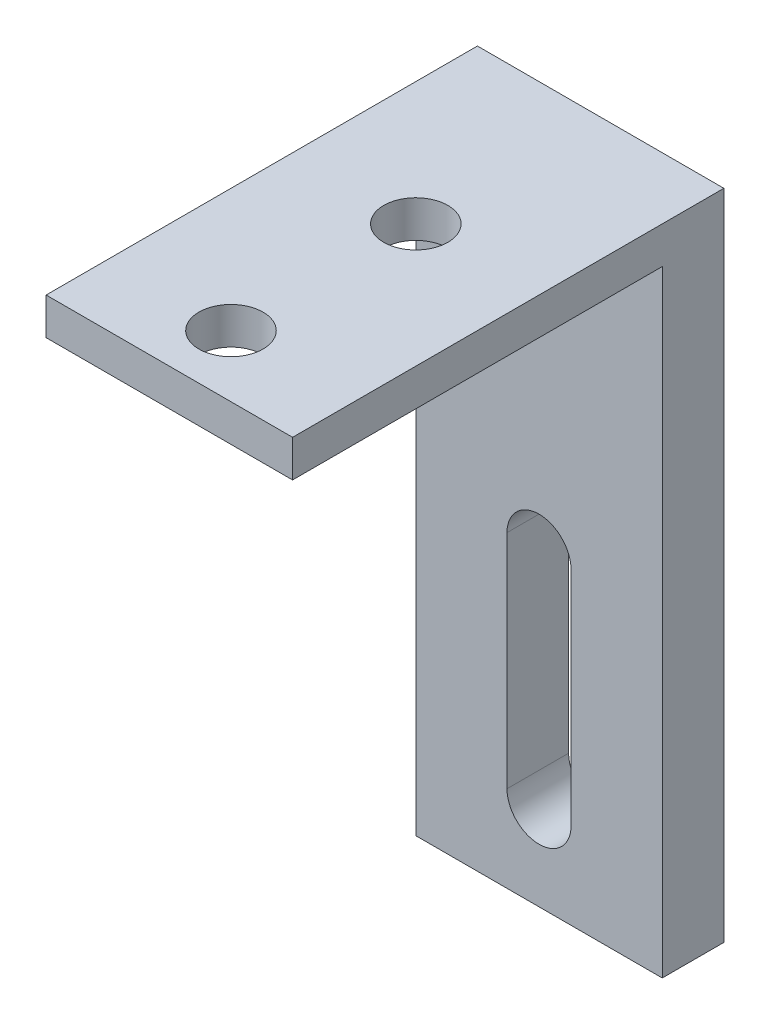
ISO-10303-21;
HEADER;
FILE_DESCRIPTION(('STEP AP214'),'2;1');
FILE_NAME('part.step','',(''),(''),'','','');
FILE_SCHEMA(('AUTOMOTIVE_DESIGN { 1 0 10303 214 1 1 1 1 }'));
ENDSEC;
DATA;
#1=APPLICATION_CONTEXT('core data for automotive mechanical design processes');
#2=APPLICATION_PROTOCOL_DEFINITION('international standard','automotive_design',2000,#1);
#3=PRODUCT_CONTEXT('',#1,'mechanical');
#4=PRODUCT('Part','Part','',(#3));
#5=PRODUCT_RELATED_PRODUCT_CATEGORY('part','',(#4));
#6=PRODUCT_DEFINITION_FORMATION('','',#4);
#7=PRODUCT_DEFINITION_CONTEXT('part definition',#1,'design');
#8=PRODUCT_DEFINITION('design','',#6,#7);
#9=PRODUCT_DEFINITION_SHAPE('','',#8);
#10=(LENGTH_UNIT() NAMED_UNIT(*) SI_UNIT(.MILLI.,.METRE.));
#11=(NAMED_UNIT(*) PLANE_ANGLE_UNIT() SI_UNIT($,.RADIAN.));
#12=(NAMED_UNIT(*) SI_UNIT($,.STERADIAN.) SOLID_ANGLE_UNIT());
#13=UNCERTAINTY_MEASURE_WITH_UNIT(LENGTH_MEASURE(1.E-05),#10,'distance_accuracy_value','');
#14=(GEOMETRIC_REPRESENTATION_CONTEXT(3) GLOBAL_UNCERTAINTY_ASSIGNED_CONTEXT((#13)) GLOBAL_UNIT_ASSIGNED_CONTEXT((#10,
#11,#12)) REPRESENTATION_CONTEXT('',''));
#15=CARTESIAN_POINT('',(0.,0.,0.));
#16=DIRECTION('',(0.,0.,1.));
#17=DIRECTION('',(1.,0.,0.));
#18=AXIS2_PLACEMENT_3D('',#15,#16,#17);
#19=CARTESIAN_POINT('',(0.,0.,0.));
#20=DIRECTION('',(0.,1.,0.));
#21=DIRECTION('',(0.,0.,1.));
#22=AXIS2_PLACEMENT_3D('',#19,#20,#21);
#23=PLANE('',#22);
#24=CARTESIAN_POINT('',(0.,0.,0.));
#25=DIRECTION('',(0.,1.,0.));
#26=DIRECTION('',(0.,0.,1.));
#27=AXIS2_PLACEMENT_3D('',#24,#25,#26);
#28=CIRCLE('',#27,2.6);
#29=CARTESIAN_POINT('',(0.,0.,2.6));
#30=VERTEX_POINT('',#29);
#31=EDGE_CURVE('E200',#30,#30,#28,.T.);
#32=ORIENTED_EDGE('',*,*,#31,.T.);
#33=EDGE_LOOP('',(#32));
#34=FACE_BOUND('',#33,.T.);
#35=CARTESIAN_POINT('',(0.,0.,15.));
#36=DIRECTION('',(0.,1.,0.));
#37=DIRECTION('',(0.,0.,1.));
#38=AXIS2_PLACEMENT_3D('',#35,#36,#37);
#39=CIRCLE('',#38,2.6);
#40=CARTESIAN_POINT('',(0.,0.,17.6));
#41=VERTEX_POINT('',#40);
#42=EDGE_CURVE('E47',#41,#41,#39,.T.);
#43=ORIENTED_EDGE('',*,*,#42,.T.);
#44=EDGE_LOOP('',(#43));
#45=FACE_BOUND('',#44,.T.);
#46=DIRECTION('',(-1.,0.,0.));
#47=VECTOR('',#46,1.);
#48=CARTESIAN_POINT('',(10.,0.,-10.));
#49=LINE('',#48,#47);
#50=CARTESIAN_POINT('',(10.,0.,-10.));
#51=VERTEX_POINT('',#50);
#52=CARTESIAN_POINT('',(-10.,0.,-10.));
#53=VERTEX_POINT('',#52);
#54=EDGE_CURVE('E154',#51,#53,#49,.T.);
#55=ORIENTED_EDGE('',*,*,#54,.F.);
#56=DIRECTION('',(0.,0.,-1.));
#57=VECTOR('',#56,1.);
#58=CARTESIAN_POINT('',(10.,0.,-10.));
#59=LINE('',#58,#57);
#60=CARTESIAN_POINT('',(10.,0.,20.));
#61=VERTEX_POINT('',#60);
#62=EDGE_CURVE('E204',#61,#51,#59,.T.);
#63=ORIENTED_EDGE('',*,*,#62,.F.);
#64=DIRECTION('',(1.,0.,0.));
#65=VECTOR('',#64,1.);
#66=CARTESIAN_POINT('',(-10.,0.,20.));
#67=LINE('',#66,#65);
#68=CARTESIAN_POINT('',(-10.,0.,20.));
#69=VERTEX_POINT('',#68);
#70=EDGE_CURVE('E191',#69,#61,#67,.T.);
#71=ORIENTED_EDGE('',*,*,#70,.F.);
#72=DIRECTION('',(0.,0.,1.));
#73=VECTOR('',#72,1.);
#74=CARTESIAN_POINT('',(-10.,0.,-10.));
#75=LINE('',#74,#73);
#76=EDGE_CURVE('E207',#53,#69,#75,.T.);
#77=ORIENTED_EDGE('',*,*,#76,.F.);
#78=EDGE_LOOP('',(#55,#63,#71,#77));
#79=FACE_BOUND('',#78,.T.);
#80=ADVANCED_FACE('F43',(#34,#45,#79),#23,.F.);
#81=CARTESIAN_POINT('',(0.,3.,0.));
#82=DIRECTION('',(0.,1.,0.));
#83=DIRECTION('',(0.,0.,1.));
#84=AXIS2_PLACEMENT_3D('',#81,#82,#83);
#85=PLANE('',#84);
#86=CARTESIAN_POINT('',(0.,3.,15.));
#87=DIRECTION('',(0.,1.,0.));
#88=DIRECTION('',(0.,0.,1.));
#89=AXIS2_PLACEMENT_3D('',#86,#87,#88);
#90=CIRCLE('',#89,2.6);
#91=CARTESIAN_POINT('',(0.,3.,17.6));
#92=VERTEX_POINT('',#91);
#93=EDGE_CURVE('E185',#92,#92,#90,.T.);
#94=ORIENTED_EDGE('',*,*,#93,.F.);
#95=EDGE_LOOP('',(#94));
#96=FACE_BOUND('',#95,.T.);
#97=DIRECTION('',(0.,0.,-1.));
#98=VECTOR('',#97,1.);
#99=CARTESIAN_POINT('',(10.,3.,-10.));
#100=LINE('',#99,#98);
#101=CARTESIAN_POINT('',(10.,3.,20.));
#102=VERTEX_POINT('',#101);
#103=CARTESIAN_POINT('',(10.,3.,-15.));
#104=VERTEX_POINT('',#103);
#105=EDGE_CURVE('E52',#102,#104,#100,.T.);
#106=ORIENTED_EDGE('',*,*,#105,.T.);
#107=DIRECTION('',(1.,0.,0.));
#108=VECTOR('',#107,1.);
#109=CARTESIAN_POINT('',(-10.,3.,-15.));
#110=LINE('',#109,#108);
#111=CARTESIAN_POINT('',(-10.,3.,-15.));
#112=VERTEX_POINT('',#111);
#113=EDGE_CURVE('E182',#112,#104,#110,.T.);
#114=ORIENTED_EDGE('',*,*,#113,.F.);
#115=DIRECTION('',(0.,0.,1.));
#116=VECTOR('',#115,1.);
#117=CARTESIAN_POINT('',(-10.,3.,-10.));
#118=LINE('',#117,#116);
#119=CARTESIAN_POINT('',(-10.,3.,20.));
#120=VERTEX_POINT('',#119);
#121=EDGE_CURVE('E11',#112,#120,#118,.T.);
#122=ORIENTED_EDGE('',*,*,#121,.T.);
#123=DIRECTION('',(-1.,0.,0.));
#124=VECTOR('',#123,1.);
#125=CARTESIAN_POINT('',(10.,3.,20.));
#126=LINE('',#125,#124);
#127=EDGE_CURVE('E197',#102,#120,#126,.T.);
#128=ORIENTED_EDGE('',*,*,#127,.F.);
#129=EDGE_LOOP('',(#106,#114,#122,#128));
#130=FACE_BOUND('',#129,.T.);
#131=CARTESIAN_POINT('',(0.,3.,0.));
#132=DIRECTION('',(0.,1.,0.));
#133=DIRECTION('',(0.,0.,1.));
#134=AXIS2_PLACEMENT_3D('',#131,#132,#133);
#135=CIRCLE('',#134,2.6);
#136=CARTESIAN_POINT('',(0.,3.,2.6));
#137=VERTEX_POINT('',#136);
#138=EDGE_CURVE('E201',#137,#137,#135,.T.);
#139=ORIENTED_EDGE('',*,*,#138,.F.);
#140=EDGE_LOOP('',(#139));
#141=FACE_BOUND('',#140,.T.);
#142=ADVANCED_FACE('F222',(#96,#130,#141),#85,.T.);
#143=CARTESIAN_POINT('',(10.,3.,-10.));
#144=DIRECTION('',(-1.,0.,0.));
#145=DIRECTION('',(0.,0.,1.));
#146=AXIS2_PLACEMENT_3D('',#143,#144,#145);
#147=PLANE('',#146);
#148=ORIENTED_EDGE('',*,*,#62,.T.);
#149=DIRECTION('',(0.,1.,0.));
#150=VECTOR('',#149,1.);
#151=CARTESIAN_POINT('',(10.,-50.,-10.));
#152=LINE('',#151,#150);
#153=CARTESIAN_POINT('',(10.,-50.,-10.));
#154=VERTEX_POINT('',#153);
#155=EDGE_CURVE('E174',#154,#51,#152,.T.);
#156=ORIENTED_EDGE('',*,*,#155,.F.);
#157=DIRECTION('',(0.,0.,1.));
#158=VECTOR('',#157,1.);
#159=CARTESIAN_POINT('',(10.,-50.,-15.));
#160=LINE('',#159,#158);
#161=CARTESIAN_POINT('',(10.,-50.,-15.));
#162=VERTEX_POINT('',#161);
#163=EDGE_CURVE('E158',#162,#154,#160,.T.);
#164=ORIENTED_EDGE('',*,*,#163,.F.);
#165=DIRECTION('',(0.,-1.,0.));
#166=VECTOR('',#165,1.);
#167=CARTESIAN_POINT('',(10.,3.,-15.));
#168=LINE('',#167,#166);
#169=EDGE_CURVE('E177',#104,#162,#168,.T.);
#170=ORIENTED_EDGE('',*,*,#169,.F.);
#171=ORIENTED_EDGE('',*,*,#105,.F.);
#172=DIRECTION('',(0.,1.,0.));
#173=VECTOR('',#172,1.);
#174=CARTESIAN_POINT('',(10.,0.,20.));
#175=LINE('',#174,#173);
#176=EDGE_CURVE('E194',#61,#102,#175,.T.);
#177=ORIENTED_EDGE('',*,*,#176,.F.);
#178=EDGE_LOOP('',(#148,#156,#164,#170,#171,#177));
#179=FACE_BOUND('',#178,.T.);
#180=ADVANCED_FACE('F45',(#179),#147,.F.);
#181=CARTESIAN_POINT('',(-10.,3.,-10.));
#182=DIRECTION('',(1.,0.,0.));
#183=DIRECTION('',(0.,0.,-1.));
#184=AXIS2_PLACEMENT_3D('',#181,#182,#183);
#185=PLANE('',#184);
#186=DIRECTION('',(0.,1.,0.));
#187=VECTOR('',#186,1.);
#188=CARTESIAN_POINT('',(-10.,0.,-15.));
#189=LINE('',#188,#187);
#190=CARTESIAN_POINT('',(-10.,-50.,-15.));
#191=VERTEX_POINT('',#190);
#192=EDGE_CURVE('E179',#191,#112,#189,.T.);
#193=ORIENTED_EDGE('',*,*,#192,.F.);
#194=DIRECTION('',(0.,0.,-1.));
#195=VECTOR('',#194,1.);
#196=CARTESIAN_POINT('',(-10.,-50.,-15.));
#197=LINE('',#196,#195);
#198=CARTESIAN_POINT('',(-10.,-50.,-10.));
#199=VERTEX_POINT('',#198);
#200=EDGE_CURVE('E163',#199,#191,#197,.T.);
#201=ORIENTED_EDGE('',*,*,#200,.F.);
#202=DIRECTION('',(0.,1.,0.));
#203=VECTOR('',#202,1.);
#204=CARTESIAN_POINT('',(-10.,-50.,-10.));
#205=LINE('',#204,#203);
#206=EDGE_CURVE('E169',#199,#53,#205,.T.);
#207=ORIENTED_EDGE('',*,*,#206,.T.);
#208=ORIENTED_EDGE('',*,*,#76,.T.);
#209=DIRECTION('',(0.,-1.,0.));
#210=VECTOR('',#209,1.);
#211=CARTESIAN_POINT('',(-10.,3.,20.));
#212=LINE('',#211,#210);
#213=EDGE_CURVE('E188',#120,#69,#212,.T.);
#214=ORIENTED_EDGE('',*,*,#213,.F.);
#215=ORIENTED_EDGE('',*,*,#121,.F.);
#216=EDGE_LOOP('',(#193,#201,#207,#208,#214,#215));
#217=FACE_BOUND('',#216,.T.);
#218=ADVANCED_FACE('F213',(#217),#185,.F.);
#219=CARTESIAN_POINT('',(0.,3.,0.));
#220=DIRECTION('',(0.,-1.,0.));
#221=DIRECTION('',(0.,0.,-1.));
#222=AXIS2_PLACEMENT_3D('',#219,#220,#221);
#223=CYLINDRICAL_SURFACE('',#222,2.6);
#224=ORIENTED_EDGE('',*,*,#138,.T.);
#225=EDGE_LOOP('',(#224));
#226=FACE_BOUND('',#225,.T.);
#227=ORIENTED_EDGE('',*,*,#31,.F.);
#228=EDGE_LOOP('',(#227));
#229=FACE_BOUND('',#228,.T.);
#230=ADVANCED_FACE('F256',(#226,#229),#223,.F.);
#231=CARTESIAN_POINT('',(0.,0.,20.));
#232=DIRECTION('',(0.,0.,1.));
#233=DIRECTION('',(1.,0.,0.));
#234=AXIS2_PLACEMENT_3D('',#231,#232,#233);
#235=PLANE('',#234);
#236=ORIENTED_EDGE('',*,*,#213,.T.);
#237=ORIENTED_EDGE('',*,*,#70,.T.);
#238=ORIENTED_EDGE('',*,*,#176,.T.);
#239=ORIENTED_EDGE('',*,*,#127,.T.);
#240=EDGE_LOOP('',(#236,#237,#238,#239));
#241=FACE_BOUND('',#240,.T.);
#242=ADVANCED_FACE('F219',(#241),#235,.T.);
#243=CARTESIAN_POINT('',(0.,-7.,15.));
#244=DIRECTION('',(0.,1.,0.));
#245=DIRECTION('',(0.,0.,1.));
#246=AXIS2_PLACEMENT_3D('',#243,#244,#245);
#247=CYLINDRICAL_SURFACE('',#246,2.6);
#248=ORIENTED_EDGE('',*,*,#93,.T.);
#249=EDGE_LOOP('',(#248));
#250=FACE_BOUND('',#249,.T.);
#251=ORIENTED_EDGE('',*,*,#42,.F.);
#252=EDGE_LOOP('',(#251));
#253=FACE_BOUND('',#252,.T.);
#254=ADVANCED_FACE('F241',(#250,#253),#247,.F.);
#255=CARTESIAN_POINT('',(0.,0.,-15.));
#256=DIRECTION('',(0.,0.,-1.));
#257=DIRECTION('',(-1.,0.,0.));
#258=AXIS2_PLACEMENT_3D('',#255,#256,#257);
#259=PLANE('',#258);
#260=CARTESIAN_POINT('',(0.,-25.,-15.));
#261=DIRECTION('',(0.,0.,-1.));
#262=DIRECTION('',(-1.,0.,0.));
#263=AXIS2_PLACEMENT_3D('',#260,#261,#262);
#264=CIRCLE('',#263,2.6);
#265=CARTESIAN_POINT('',(-2.6,-25.,-15.));
#266=VERTEX_POINT('',#265);
#267=CARTESIAN_POINT('',(2.6,-25.,-15.));
#268=VERTEX_POINT('',#267);
#269=EDGE_CURVE('E60',#266,#268,#264,.T.);
#270=ORIENTED_EDGE('',*,*,#269,.F.);
#271=DIRECTION('',(0.,-1.,0.));
#272=VECTOR('',#271,1.);
#273=CARTESIAN_POINT('',(-2.6,-25.,-15.));
#274=LINE('',#273,#272);
#275=CARTESIAN_POINT('',(-2.60000000000001,-43.,-15.));
#276=VERTEX_POINT('',#275);
#277=EDGE_CURVE('E139',#266,#276,#274,.T.);
#278=ORIENTED_EDGE('',*,*,#277,.T.);
#279=CARTESIAN_POINT('',(0.,-43.,-15.));
#280=DIRECTION('',(0.,0.,-1.));
#281=DIRECTION('',(-1.,0.,0.));
#282=AXIS2_PLACEMENT_3D('',#279,#280,#281);
#283=CIRCLE('',#282,2.6);
#284=CARTESIAN_POINT('',(2.59999999999999,-43.,-15.));
#285=VERTEX_POINT('',#284);
#286=EDGE_CURVE('E142',#285,#276,#283,.T.);
#287=ORIENTED_EDGE('',*,*,#286,.F.);
#288=DIRECTION('',(0.,-1.,0.));
#289=VECTOR('',#288,1.);
#290=CARTESIAN_POINT('',(2.6,-25.,-15.));
#291=LINE('',#290,#289);
#292=EDGE_CURVE('E148',#268,#285,#291,.T.);
#293=ORIENTED_EDGE('',*,*,#292,.F.);
#294=EDGE_LOOP('',(#270,#278,#287,#293));
#295=FACE_BOUND('',#294,.T.);
#296=ORIENTED_EDGE('',*,*,#169,.T.);
#297=DIRECTION('',(1.,0.,0.));
#298=VECTOR('',#297,1.);
#299=CARTESIAN_POINT('',(10.,-50.,-15.));
#300=LINE('',#299,#298);
#301=EDGE_CURVE('E166',#191,#162,#300,.T.);
#302=ORIENTED_EDGE('',*,*,#301,.F.);
#303=ORIENTED_EDGE('',*,*,#192,.T.);
#304=ORIENTED_EDGE('',*,*,#113,.T.);
#305=EDGE_LOOP('',(#296,#302,#303,#304));
#306=FACE_BOUND('',#305,.T.);
#307=ADVANCED_FACE('F227',(#295,#306),#259,.T.);
#308=CARTESIAN_POINT('',(10.,-50.,-10.));
#309=DIRECTION('',(0.,0.,-1.));
#310=DIRECTION('',(-1.,0.,0.));
#311=AXIS2_PLACEMENT_3D('',#308,#309,#310);
#312=PLANE('',#311);
#313=DIRECTION('',(0.,-1.,0.));
#314=VECTOR('',#313,1.);
#315=CARTESIAN_POINT('',(-2.6,-25.,-10.));
#316=LINE('',#315,#314);
#317=CARTESIAN_POINT('',(-2.6,-25.,-10.));
#318=VERTEX_POINT('',#317);
#319=CARTESIAN_POINT('',(-2.60000000000001,-43.,-10.));
#320=VERTEX_POINT('',#319);
#321=EDGE_CURVE('E130',#318,#320,#316,.T.);
#322=ORIENTED_EDGE('',*,*,#321,.F.);
#323=CARTESIAN_POINT('',(0.,-25.,-10.));
#324=DIRECTION('',(0.,0.,-1.));
#325=DIRECTION('',(-1.,0.,0.));
#326=AXIS2_PLACEMENT_3D('',#323,#324,#325);
#327=CIRCLE('',#326,2.6);
#328=CARTESIAN_POINT('',(2.6,-25.,-10.));
#329=VERTEX_POINT('',#328);
#330=EDGE_CURVE('E124',#318,#329,#327,.T.);
#331=ORIENTED_EDGE('',*,*,#330,.T.);
#332=DIRECTION('',(0.,-1.,0.));
#333=VECTOR('',#332,1.);
#334=CARTESIAN_POINT('',(2.6,-25.,-10.));
#335=LINE('',#334,#333);
#336=CARTESIAN_POINT('',(2.59999999999999,-43.,-10.));
#337=VERTEX_POINT('',#336);
#338=EDGE_CURVE('E133',#329,#337,#335,.T.);
#339=ORIENTED_EDGE('',*,*,#338,.T.);
#340=CARTESIAN_POINT('',(0.,-43.,-10.));
#341=DIRECTION('',(0.,0.,-1.));
#342=DIRECTION('',(-1.,0.,0.));
#343=AXIS2_PLACEMENT_3D('',#340,#341,#342);
#344=CIRCLE('',#343,2.6);
#345=EDGE_CURVE('E68',#337,#320,#344,.T.);
#346=ORIENTED_EDGE('',*,*,#345,.T.);
#347=EDGE_LOOP('',(#322,#331,#339,#346));
#348=FACE_BOUND('',#347,.T.);
#349=ORIENTED_EDGE('',*,*,#54,.T.);
#350=ORIENTED_EDGE('',*,*,#206,.F.);
#351=DIRECTION('',(-1.,0.,0.));
#352=VECTOR('',#351,1.);
#353=CARTESIAN_POINT('',(10.,-50.,-10.));
#354=LINE('',#353,#352);
#355=EDGE_CURVE('E161',#154,#199,#354,.T.);
#356=ORIENTED_EDGE('',*,*,#355,.F.);
#357=ORIENTED_EDGE('',*,*,#155,.T.);
#358=EDGE_LOOP('',(#349,#350,#356,#357));
#359=FACE_BOUND('',#358,.T.);
#360=ADVANCED_FACE('F137',(#348,#359),#312,.F.);
#361=CARTESIAN_POINT('',(0.,-50.,0.));
#362=DIRECTION('',(0.,-1.,0.));
#363=DIRECTION('',(0.,0.,-1.));
#364=AXIS2_PLACEMENT_3D('',#361,#362,#363);
#365=PLANE('',#364);
#366=ORIENTED_EDGE('',*,*,#163,.T.);
#367=ORIENTED_EDGE('',*,*,#355,.T.);
#368=ORIENTED_EDGE('',*,*,#200,.T.);
#369=ORIENTED_EDGE('',*,*,#301,.T.);
#370=EDGE_LOOP('',(#366,#367,#368,#369));
#371=FACE_BOUND('',#370,.T.);
#372=ADVANCED_FACE('F231',(#371),#365,.T.);
#373=CARTESIAN_POINT('',(0.,-25.,-10.));
#374=DIRECTION('',(0.,0.,-1.));
#375=DIRECTION('',(-1.,0.,0.));
#376=AXIS2_PLACEMENT_3D('',#373,#374,#375);
#377=CYLINDRICAL_SURFACE('',#376,2.6);
#378=ORIENTED_EDGE('',*,*,#269,.T.);
#379=DIRECTION('',(0.,0.,-1.));
#380=VECTOR('',#379,1.);
#381=CARTESIAN_POINT('',(2.6,-25.,-10.));
#382=LINE('',#381,#380);
#383=EDGE_CURVE('E120',#329,#268,#382,.T.);
#384=ORIENTED_EDGE('',*,*,#383,.F.);
#385=ORIENTED_EDGE('',*,*,#330,.F.);
#386=DIRECTION('',(0.,0.,-1.));
#387=VECTOR('',#386,1.);
#388=CARTESIAN_POINT('',(-2.6,-25.,-10.));
#389=LINE('',#388,#387);
#390=EDGE_CURVE('E152',#318,#266,#389,.T.);
#391=ORIENTED_EDGE('',*,*,#390,.T.);
#392=EDGE_LOOP('',(#378,#384,#385,#391));
#393=FACE_BOUND('',#392,.T.);
#394=ADVANCED_FACE('F122',(#393),#377,.F.);
#395=CARTESIAN_POINT('',(-2.6,-25.,-10.));
#396=DIRECTION('',(1.,0.,0.));
#397=DIRECTION('',(0.,1.,0.));
#398=AXIS2_PLACEMENT_3D('',#395,#396,#397);
#399=PLANE('',#398);
#400=ORIENTED_EDGE('',*,*,#277,.F.);
#401=ORIENTED_EDGE('',*,*,#390,.F.);
#402=ORIENTED_EDGE('',*,*,#321,.T.);
#403=DIRECTION('',(0.,0.,-1.));
#404=VECTOR('',#403,1.);
#405=CARTESIAN_POINT('',(-2.60000000000001,-43.,-10.));
#406=LINE('',#405,#404);
#407=EDGE_CURVE('E155',#320,#276,#406,.T.);
#408=ORIENTED_EDGE('',*,*,#407,.T.);
#409=EDGE_LOOP('',(#400,#401,#402,#408));
#410=FACE_BOUND('',#409,.T.);
#411=ADVANCED_FACE('F307',(#410),#399,.T.);
#412=CARTESIAN_POINT('',(0.,-43.,-10.));
#413=DIRECTION('',(0.,0.,-1.));
#414=DIRECTION('',(-1.,0.,0.));
#415=AXIS2_PLACEMENT_3D('',#412,#413,#414);
#416=CYLINDRICAL_SURFACE('',#415,2.6);
#417=ORIENTED_EDGE('',*,*,#286,.T.);
#418=ORIENTED_EDGE('',*,*,#407,.F.);
#419=ORIENTED_EDGE('',*,*,#345,.F.);
#420=DIRECTION('',(0.,0.,-1.));
#421=VECTOR('',#420,1.);
#422=CARTESIAN_POINT('',(2.59999999999999,-43.,-10.));
#423=LINE('',#422,#421);
#424=EDGE_CURVE('E129',#337,#285,#423,.T.);
#425=ORIENTED_EDGE('',*,*,#424,.T.);
#426=EDGE_LOOP('',(#417,#418,#419,#425));
#427=FACE_BOUND('',#426,.T.);
#428=ADVANCED_FACE('F316',(#427),#416,.F.);
#429=CARTESIAN_POINT('',(2.6,-25.,-10.));
#430=DIRECTION('',(1.,0.,0.));
#431=DIRECTION('',(0.,1.,0.));
#432=AXIS2_PLACEMENT_3D('',#429,#430,#431);
#433=PLANE('',#432);
#434=ORIENTED_EDGE('',*,*,#292,.T.);
#435=ORIENTED_EDGE('',*,*,#424,.F.);
#436=ORIENTED_EDGE('',*,*,#338,.F.);
#437=ORIENTED_EDGE('',*,*,#383,.T.);
#438=EDGE_LOOP('',(#434,#435,#436,#437));
#439=FACE_BOUND('',#438,.T.);
#440=ADVANCED_FACE('F134',(#439),#433,.F.);
#441=CLOSED_SHELL('',(#80,#142,#180,#218,#230,#242,#254,#307,#360,#372,#394,#411,#428,#440));
#442=MANIFOLD_SOLID_BREP('B2',#441);
#443=ADVANCED_BREP_SHAPE_REPRESENTATION('',(#18,#442),#14);
#444=SHAPE_DEFINITION_REPRESENTATION(#9,#443);
ENDSEC;
END-ISO-10303-21;
